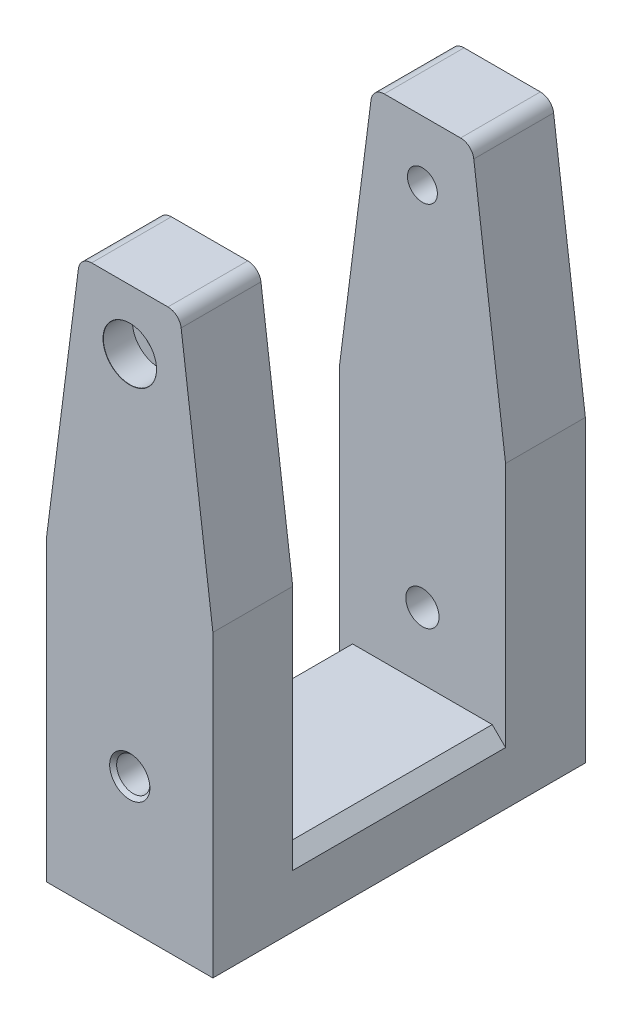
ISO-10303-21;
HEADER;
FILE_DESCRIPTION(('STEP AP214'),'2;1');
FILE_NAME('part.step','',(''),(''),'','','');
FILE_SCHEMA(('AUTOMOTIVE_DESIGN { 1 0 10303 214 1 1 1 1 }'));
ENDSEC;
DATA;
#1=APPLICATION_CONTEXT('core data for automotive mechanical design processes');
#2=APPLICATION_PROTOCOL_DEFINITION('international standard','automotive_design',2000,#1);
#3=PRODUCT_CONTEXT('',#1,'mechanical');
#4=PRODUCT('Part','Part','',(#3));
#5=PRODUCT_RELATED_PRODUCT_CATEGORY('part','',(#4));
#6=PRODUCT_DEFINITION_FORMATION('','',#4);
#7=PRODUCT_DEFINITION_CONTEXT('part definition',#1,'design');
#8=PRODUCT_DEFINITION('design','',#6,#7);
#9=PRODUCT_DEFINITION_SHAPE('','',#8);
#10=(LENGTH_UNIT() NAMED_UNIT(*) SI_UNIT(.MILLI.,.METRE.));
#11=(NAMED_UNIT(*) PLANE_ANGLE_UNIT() SI_UNIT($,.RADIAN.));
#12=(NAMED_UNIT(*) SI_UNIT($,.STERADIAN.) SOLID_ANGLE_UNIT());
#13=UNCERTAINTY_MEASURE_WITH_UNIT(LENGTH_MEASURE(1.E-05),#10,'distance_accuracy_value','');
#14=(GEOMETRIC_REPRESENTATION_CONTEXT(3) GLOBAL_UNCERTAINTY_ASSIGNED_CONTEXT((#13)) GLOBAL_UNIT_ASSIGNED_CONTEXT((#10,
#11,#12)) REPRESENTATION_CONTEXT('',''));
#15=CARTESIAN_POINT('',(0.,0.,0.));
#16=DIRECTION('',(0.,0.,1.));
#17=DIRECTION('',(1.,0.,0.));
#18=AXIS2_PLACEMENT_3D('',#15,#16,#17);
#19=CARTESIAN_POINT('',(7.5,84.,28.));
#20=DIRECTION('',(-0.991881664685851,-0.127164315985365,0.));
#21=DIRECTION('',(0.127164315985365,-0.991881664685851,0.));
#22=AXIS2_PLACEMENT_3D('',#19,#20,#21);
#23=PLANE('',#22);
#24=DIRECTION('',(-0.127164315985365,0.991881664685851,0.));
#25=VECTOR('',#24,1.);
#26=CARTESIAN_POINT('',(7.5,84.,16.));
#27=LINE('',#26,#25);
#28=CARTESIAN_POINT('',(12.5,45.,16.));
#29=VERTEX_POINT('',#28);
#30=CARTESIAN_POINT('',(7.72380402154221,82.2543286319707,16.));
#31=VERTEX_POINT('',#30);
#32=EDGE_CURVE('E301',#29,#31,#27,.T.);
#33=ORIENTED_EDGE('',*,*,#32,.T.);
#34=DIRECTION('',(0.,0.,-1.));
#35=VECTOR('',#34,1.);
#36=CARTESIAN_POINT('',(7.72380402154221,82.2543286319707,28.));
#37=LINE('',#36,#35);
#38=CARTESIAN_POINT('',(7.72380402154221,82.2543286319707,28.));
#39=VERTEX_POINT('',#38);
#40=EDGE_CURVE('E11',#31,#39,#37,.F.);
#41=ORIENTED_EDGE('',*,*,#40,.T.);
#42=DIRECTION('',(-0.127164315985365,0.99188166468585,0.));
#43=VECTOR('',#42,1.);
#44=CARTESIAN_POINT('',(7.5,84.,28.));
#45=LINE('',#44,#43);
#46=CARTESIAN_POINT('',(12.5,45.,28.));
#47=VERTEX_POINT('',#46);
#48=EDGE_CURVE('E306',#47,#39,#45,.T.);
#49=ORIENTED_EDGE('',*,*,#48,.F.);
#50=DIRECTION('',(0.,0.,-1.));
#51=VECTOR('',#50,1.);
#52=CARTESIAN_POINT('',(12.5,45.,28.));
#53=LINE('',#52,#51);
#54=EDGE_CURVE('E191',#47,#29,#53,.T.);
#55=ORIENTED_EDGE('',*,*,#54,.T.);
#56=EDGE_LOOP('',(#33,#41,#49,#55));
#57=FACE_BOUND('',#56,.T.);
#58=ADVANCED_FACE('F35',(#57),#23,.F.);
#59=CARTESIAN_POINT('',(-7.5,84.,28.));
#60=DIRECTION('',(0.,-1.,0.));
#61=DIRECTION('',(0.,0.,-1.));
#62=AXIS2_PLACEMENT_3D('',#59,#60,#61);
#63=PLANE('',#62);
#64=DIRECTION('',(1.,0.,0.));
#65=VECTOR('',#64,1.);
#66=CARTESIAN_POINT('',(-12.5,84.,16.));
#67=LINE('',#66,#65);
#68=CARTESIAN_POINT('',(-5.74004069217051,84.,16.));
#69=VERTEX_POINT('',#68);
#70=CARTESIAN_POINT('',(5.74004069217051,84.,16.));
#71=VERTEX_POINT('',#70);
#72=EDGE_CURVE('E283',#69,#71,#67,.T.);
#73=ORIENTED_EDGE('',*,*,#72,.F.);
#74=DIRECTION('',(0.,0.,-1.));
#75=VECTOR('',#74,1.);
#76=CARTESIAN_POINT('',(-5.74004069217051,84.,28.));
#77=LINE('',#76,#75);
#78=CARTESIAN_POINT('',(-5.74004069217051,84.,28.));
#79=VERTEX_POINT('',#78);
#80=EDGE_CURVE('E57',#69,#79,#77,.F.);
#81=ORIENTED_EDGE('',*,*,#80,.T.);
#82=DIRECTION('',(-1.,0.,0.));
#83=VECTOR('',#82,1.);
#84=CARTESIAN_POINT('',(-7.5,84.,28.));
#85=LINE('',#84,#83);
#86=CARTESIAN_POINT('',(5.74004069217051,84.,28.));
#87=VERTEX_POINT('',#86);
#88=EDGE_CURVE('E270',#87,#79,#85,.T.);
#89=ORIENTED_EDGE('',*,*,#88,.F.);
#90=DIRECTION('',(0.,0.,-1.));
#91=VECTOR('',#90,1.);
#92=CARTESIAN_POINT('',(5.74004069217051,84.,28.));
#93=LINE('',#92,#91);
#94=EDGE_CURVE('E258',#87,#71,#93,.T.);
#95=ORIENTED_EDGE('',*,*,#94,.T.);
#96=EDGE_LOOP('',(#73,#81,#89,#95));
#97=FACE_BOUND('',#96,.T.);
#98=ADVANCED_FACE('F285',(#97),#63,.F.);
#99=CARTESIAN_POINT('',(-12.5,45.,28.));
#100=DIRECTION('',(0.991881664685851,-0.127164315985365,0.));
#101=DIRECTION('',(0.127164315985365,0.991881664685851,0.));
#102=AXIS2_PLACEMENT_3D('',#99,#100,#101);
#103=PLANE('',#102);
#104=DIRECTION('',(-0.127164315985365,-0.99188166468585,0.));
#105=VECTOR('',#104,1.);
#106=CARTESIAN_POINT('',(-12.5,45.,28.));
#107=LINE('',#106,#105);
#108=CARTESIAN_POINT('',(-7.72380402154221,82.2543286319707,28.));
#109=VERTEX_POINT('',#108);
#110=CARTESIAN_POINT('',(-12.5,45.,28.));
#111=VERTEX_POINT('',#110);
#112=EDGE_CURVE('E268',#109,#111,#107,.T.);
#113=ORIENTED_EDGE('',*,*,#112,.F.);
#114=DIRECTION('',(0.,0.,-1.));
#115=VECTOR('',#114,1.);
#116=CARTESIAN_POINT('',(-7.72380402154221,82.2543286319707,28.));
#117=LINE('',#116,#115);
#118=CARTESIAN_POINT('',(-7.72380402154221,82.2543286319707,16.));
#119=VERTEX_POINT('',#118);
#120=EDGE_CURVE('E251',#109,#119,#117,.T.);
#121=ORIENTED_EDGE('',*,*,#120,.T.);
#122=DIRECTION('',(-0.127164315985365,-0.991881664685851,0.));
#123=VECTOR('',#122,1.);
#124=CARTESIAN_POINT('',(-12.5,45.,16.));
#125=LINE('',#124,#123);
#126=CARTESIAN_POINT('',(-12.5,45.,16.));
#127=VERTEX_POINT('',#126);
#128=EDGE_CURVE('E172',#119,#127,#125,.T.);
#129=ORIENTED_EDGE('',*,*,#128,.T.);
#130=DIRECTION('',(0.,0.,-1.));
#131=VECTOR('',#130,1.);
#132=CARTESIAN_POINT('',(-12.5,45.,28.));
#133=LINE('',#132,#131);
#134=EDGE_CURVE('E192',#111,#127,#133,.T.);
#135=ORIENTED_EDGE('',*,*,#134,.F.);
#136=EDGE_LOOP('',(#113,#121,#129,#135));
#137=FACE_BOUND('',#136,.T.);
#138=ADVANCED_FACE('F274',(#137),#103,.F.);
#139=CARTESIAN_POINT('',(12.5,45.,28.));
#140=DIRECTION('',(-1.,0.,0.));
#141=DIRECTION('',(0.,0.,1.));
#142=AXIS2_PLACEMENT_3D('',#139,#140,#141);
#143=PLANE('',#142);
#144=DIRECTION('',(0.,1.,0.));
#145=VECTOR('',#144,1.);
#146=CARTESIAN_POINT('',(12.5,84.,-16.));
#147=LINE('',#146,#145);
#148=CARTESIAN_POINT('',(12.5,7.99999999999998,-16.));
#149=VERTEX_POINT('',#148);
#150=CARTESIAN_POINT('',(12.5,45.,-16.));
#151=VERTEX_POINT('',#150);
#152=EDGE_CURVE('E176',#149,#151,#147,.T.);
#153=ORIENTED_EDGE('',*,*,#152,.F.);
#154=DIRECTION('',(0.,0.,1.));
#155=VECTOR('',#154,1.);
#156=CARTESIAN_POINT('',(12.5,7.99999999999998,28.));
#157=LINE('',#156,#155);
#158=CARTESIAN_POINT('',(12.5,7.99999999999998,16.));
#159=VERTEX_POINT('',#158);
#160=EDGE_CURVE('E224',#149,#159,#157,.T.);
#161=ORIENTED_EDGE('',*,*,#160,.T.);
#162=DIRECTION('',(0.,-1.,0.));
#163=VECTOR('',#162,1.);
#164=CARTESIAN_POINT('',(12.5,84.,16.));
#165=LINE('',#164,#163);
#166=EDGE_CURVE('E184',#29,#159,#165,.T.);
#167=ORIENTED_EDGE('',*,*,#166,.F.);
#168=ORIENTED_EDGE('',*,*,#54,.F.);
#169=DIRECTION('',(0.,1.,0.));
#170=VECTOR('',#169,1.);
#171=CARTESIAN_POINT('',(12.5,45.,28.));
#172=LINE('',#171,#170);
#173=CARTESIAN_POINT('',(12.5,0.,28.));
#174=VERTEX_POINT('',#173);
#175=EDGE_CURVE('E303',#174,#47,#172,.T.);
#176=ORIENTED_EDGE('',*,*,#175,.F.);
#177=DIRECTION('',(0.,0.,-1.));
#178=VECTOR('',#177,1.);
#179=CARTESIAN_POINT('',(12.5,0.,28.));
#180=LINE('',#179,#178);
#181=CARTESIAN_POINT('',(12.5,0.,-28.));
#182=VERTEX_POINT('',#181);
#183=EDGE_CURVE('E313',#174,#182,#180,.T.);
#184=ORIENTED_EDGE('',*,*,#183,.T.);
#185=DIRECTION('',(0.,1.,0.));
#186=VECTOR('',#185,1.);
#187=CARTESIAN_POINT('',(12.5,45.,-28.));
#188=LINE('',#187,#186);
#189=CARTESIAN_POINT('',(12.5,45.,-28.));
#190=VERTEX_POINT('',#189);
#191=EDGE_CURVE('E190',#182,#190,#188,.T.);
#192=ORIENTED_EDGE('',*,*,#191,.T.);
#193=EDGE_CURVE('E166',#151,#190,#53,.T.);
#194=ORIENTED_EDGE('',*,*,#193,.F.);
#195=EDGE_LOOP('',(#153,#161,#167,#168,#176,#184,#192,#194));
#196=FACE_BOUND('',#195,.T.);
#197=ADVANCED_FACE('F187',(#196),#143,.F.);
#198=DIRECTION('',(-0.127164315985365,0.99188166468585,0.));
#199=VECTOR('',#198,1.);
#200=CARTESIAN_POINT('',(7.5,84.,-28.));
#201=LINE('',#200,#199);
#202=CARTESIAN_POINT('',(7.72380402154221,82.2543286319707,-28.));
#203=VERTEX_POINT('',#202);
#204=EDGE_CURVE('E315',#190,#203,#201,.T.);
#205=ORIENTED_EDGE('',*,*,#204,.T.);
#206=DIRECTION('',(0.,0.,-1.));
#207=VECTOR('',#206,1.);
#208=CARTESIAN_POINT('',(7.72380402154221,82.2543286319707,28.));
#209=LINE('',#208,#207);
#210=CARTESIAN_POINT('',(7.72380402154221,82.2543286319707,-16.));
#211=VERTEX_POINT('',#210);
#212=EDGE_CURVE('E169',#203,#211,#209,.F.);
#213=ORIENTED_EDGE('',*,*,#212,.T.);
#214=DIRECTION('',(0.127164315985365,-0.991881664685851,0.));
#215=VECTOR('',#214,1.);
#216=CARTESIAN_POINT('',(7.5,84.,-16.));
#217=LINE('',#216,#215);
#218=EDGE_CURVE('E161',#211,#151,#217,.T.);
#219=ORIENTED_EDGE('',*,*,#218,.T.);
#220=ORIENTED_EDGE('',*,*,#193,.T.);
#221=EDGE_LOOP('',(#205,#213,#219,#220));
#222=FACE_BOUND('',#221,.T.);
#223=ADVANCED_FACE('F164',(#222),#23,.F.);
#224=DIRECTION('',(1.,0.,0.));
#225=VECTOR('',#224,1.);
#226=CARTESIAN_POINT('',(-12.5,84.,-16.));
#227=LINE('',#226,#225);
#228=CARTESIAN_POINT('',(-5.74004069217051,84.,-16.));
#229=VERTEX_POINT('',#228);
#230=CARTESIAN_POINT('',(5.74004069217051,84.,-16.));
#231=VERTEX_POINT('',#230);
#232=EDGE_CURVE('E287',#229,#231,#227,.T.);
#233=ORIENTED_EDGE('',*,*,#232,.T.);
#234=DIRECTION('',(0.,0.,-1.));
#235=VECTOR('',#234,1.);
#236=CARTESIAN_POINT('',(5.74004069217051,84.,28.));
#237=LINE('',#236,#235);
#238=CARTESIAN_POINT('',(5.74004069217051,84.,-28.));
#239=VERTEX_POINT('',#238);
#240=EDGE_CURVE('E236',#231,#239,#237,.T.);
#241=ORIENTED_EDGE('',*,*,#240,.T.);
#242=DIRECTION('',(-1.,0.,0.));
#243=VECTOR('',#242,1.);
#244=CARTESIAN_POINT('',(-7.5,84.,-28.));
#245=LINE('',#244,#243);
#246=CARTESIAN_POINT('',(-5.74004069217051,84.,-28.));
#247=VERTEX_POINT('',#246);
#248=EDGE_CURVE('E317',#239,#247,#245,.T.);
#249=ORIENTED_EDGE('',*,*,#248,.T.);
#250=DIRECTION('',(0.,0.,-1.));
#251=VECTOR('',#250,1.);
#252=CARTESIAN_POINT('',(-5.74004069217051,84.,28.));
#253=LINE('',#252,#251);
#254=EDGE_CURVE('E234',#247,#229,#253,.F.);
#255=ORIENTED_EDGE('',*,*,#254,.T.);
#256=EDGE_LOOP('',(#233,#241,#249,#255));
#257=FACE_BOUND('',#256,.T.);
#258=ADVANCED_FACE('F379',(#257),#63,.F.);
#259=DIRECTION('',(0.127164315985365,0.991881664685851,0.));
#260=VECTOR('',#259,1.);
#261=CARTESIAN_POINT('',(-12.5,45.,-16.));
#262=LINE('',#261,#260);
#263=CARTESIAN_POINT('',(-12.5,45.,-16.));
#264=VERTEX_POINT('',#263);
#265=CARTESIAN_POINT('',(-7.72380402154221,82.2543286319707,-16.));
#266=VERTEX_POINT('',#265);
#267=EDGE_CURVE('E173',#264,#266,#262,.T.);
#268=ORIENTED_EDGE('',*,*,#267,.T.);
#269=DIRECTION('',(0.,0.,-1.));
#270=VECTOR('',#269,1.);
#271=CARTESIAN_POINT('',(-7.72380402154221,82.2543286319707,28.));
#272=LINE('',#271,#270);
#273=CARTESIAN_POINT('',(-7.72380402154221,82.2543286319707,-28.));
#274=VERTEX_POINT('',#273);
#275=EDGE_CURVE('E248',#266,#274,#272,.T.);
#276=ORIENTED_EDGE('',*,*,#275,.T.);
#277=DIRECTION('',(-0.127164315985365,-0.99188166468585,0.));
#278=VECTOR('',#277,1.);
#279=CARTESIAN_POINT('',(-12.5,45.,-28.));
#280=LINE('',#279,#278);
#281=CARTESIAN_POINT('',(-12.5,45.,-28.));
#282=VERTEX_POINT('',#281);
#283=EDGE_CURVE('E320',#274,#282,#280,.T.);
#284=ORIENTED_EDGE('',*,*,#283,.T.);
#285=EDGE_CURVE('E197',#264,#282,#133,.T.);
#286=ORIENTED_EDGE('',*,*,#285,.F.);
#287=EDGE_LOOP('',(#268,#276,#284,#286));
#288=FACE_BOUND('',#287,.T.);
#289=ADVANCED_FACE('F386',(#288),#103,.F.);
#290=CARTESIAN_POINT('',(-12.5,0.,28.));
#291=DIRECTION('',(1.,0.,0.));
#292=DIRECTION('',(0.,0.,-1.));
#293=AXIS2_PLACEMENT_3D('',#290,#291,#292);
#294=PLANE('',#293);
#295=DIRECTION('',(0.,0.,-1.));
#296=VECTOR('',#295,1.);
#297=CARTESIAN_POINT('',(-12.5,7.99999999999998,28.));
#298=LINE('',#297,#296);
#299=CARTESIAN_POINT('',(-12.5,7.99999999999998,16.));
#300=VERTEX_POINT('',#299);
#301=CARTESIAN_POINT('',(-12.5,7.99999999999998,-16.));
#302=VERTEX_POINT('',#301);
#303=EDGE_CURVE('E202',#300,#302,#298,.T.);
#304=ORIENTED_EDGE('',*,*,#303,.T.);
#305=DIRECTION('',(0.,1.,0.));
#306=VECTOR('',#305,1.);
#307=CARTESIAN_POINT('',(-12.5,84.,-16.));
#308=LINE('',#307,#306);
#309=EDGE_CURVE('E183',#302,#264,#308,.T.);
#310=ORIENTED_EDGE('',*,*,#309,.T.);
#311=ORIENTED_EDGE('',*,*,#285,.T.);
#312=DIRECTION('',(0.,-1.,0.));
#313=VECTOR('',#312,1.);
#314=CARTESIAN_POINT('',(-12.5,0.,-28.));
#315=LINE('',#314,#313);
#316=CARTESIAN_POINT('',(-12.5,0.,-28.));
#317=VERTEX_POINT('',#316);
#318=EDGE_CURVE('E322',#282,#317,#315,.T.);
#319=ORIENTED_EDGE('',*,*,#318,.T.);
#320=DIRECTION('',(0.,0.,-1.));
#321=VECTOR('',#320,1.);
#322=CARTESIAN_POINT('',(-12.5,0.,28.));
#323=LINE('',#322,#321);
#324=CARTESIAN_POINT('',(-12.5,0.,28.));
#325=VERTEX_POINT('',#324);
#326=EDGE_CURVE('E325',#325,#317,#323,.T.);
#327=ORIENTED_EDGE('',*,*,#326,.F.);
#328=DIRECTION('',(0.,-1.,0.));
#329=VECTOR('',#328,1.);
#330=CARTESIAN_POINT('',(-12.5,0.,28.));
#331=LINE('',#330,#329);
#332=EDGE_CURVE('E277',#111,#325,#331,.T.);
#333=ORIENTED_EDGE('',*,*,#332,.F.);
#334=ORIENTED_EDGE('',*,*,#134,.T.);
#335=DIRECTION('',(0.,-1.,0.));
#336=VECTOR('',#335,1.);
#337=CARTESIAN_POINT('',(-12.5,0.,16.));
#338=LINE('',#337,#336);
#339=EDGE_CURVE('E195',#127,#300,#338,.T.);
#340=ORIENTED_EDGE('',*,*,#339,.T.);
#341=EDGE_LOOP('',(#304,#310,#311,#319,#327,#333,#334,#340));
#342=FACE_BOUND('',#341,.T.);
#343=ADVANCED_FACE('F336',(#342),#294,.F.);
#344=CARTESIAN_POINT('',(12.5,0.,28.));
#345=DIRECTION('',(0.,1.,0.));
#346=DIRECTION('',(0.,0.,1.));
#347=AXIS2_PLACEMENT_3D('',#344,#345,#346);
#348=PLANE('',#347);
#349=DIRECTION('',(1.,0.,0.));
#350=VECTOR('',#349,1.);
#351=CARTESIAN_POINT('',(12.5,0.,-28.));
#352=LINE('',#351,#350);
#353=EDGE_CURVE('E307',#317,#182,#352,.T.);
#354=ORIENTED_EDGE('',*,*,#353,.T.);
#355=ORIENTED_EDGE('',*,*,#183,.F.);
#356=DIRECTION('',(1.,0.,0.));
#357=VECTOR('',#356,1.);
#358=CARTESIAN_POINT('',(12.5,0.,28.));
#359=LINE('',#358,#357);
#360=EDGE_CURVE('E311',#325,#174,#359,.T.);
#361=ORIENTED_EDGE('',*,*,#360,.F.);
#362=ORIENTED_EDGE('',*,*,#326,.T.);
#363=EDGE_LOOP('',(#354,#355,#361,#362));
#364=FACE_BOUND('',#363,.T.);
#365=ADVANCED_FACE('F343',(#364),#348,.F.);
#366=CARTESIAN_POINT('',(0.,0.,28.));
#367=DIRECTION('',(0.,0.,-1.));
#368=DIRECTION('',(-1.,0.,0.));
#369=AXIS2_PLACEMENT_3D('',#366,#367,#368);
#370=PLANE('',#369);
#371=CARTESIAN_POINT('',(0.,20.,28.));
#372=DIRECTION('',(0.,0.,1.));
#373=DIRECTION('',(1.,0.,0.));
#374=AXIS2_PLACEMENT_3D('',#371,#372,#373);
#375=CIRCLE('',#374,3.025);
#376=CARTESIAN_POINT('',(3.025,20.,28.));
#377=VERTEX_POINT('',#376);
#378=EDGE_CURVE('E485',#377,#377,#375,.T.);
#379=ORIENTED_EDGE('',*,*,#378,.F.);
#380=EDGE_LOOP('',(#379));
#381=FACE_BOUND('',#380,.T.);
#382=CARTESIAN_POINT('',(0.,75.,28.));
#383=DIRECTION('',(0.,0.,1.));
#384=DIRECTION('',(1.,0.,0.));
#385=AXIS2_PLACEMENT_3D('',#382,#383,#384);
#386=CIRCLE('',#385,4.025);
#387=CARTESIAN_POINT('',(4.025,75.,28.));
#388=VERTEX_POINT('',#387);
#389=EDGE_CURVE('E210',#388,#388,#386,.T.);
#390=ORIENTED_EDGE('',*,*,#389,.F.);
#391=EDGE_LOOP('',(#390));
#392=FACE_BOUND('',#391,.T.);
#393=ORIENTED_EDGE('',*,*,#88,.T.);
#394=CARTESIAN_POINT('',(-5.74004069217051,82.,28.));
#395=DIRECTION('',(0.,0.,-1.));
#396=DIRECTION('',(-1.,0.,0.));
#397=AXIS2_PLACEMENT_3D('',#394,#395,#396);
#398=CIRCLE('',#397,2.);
#399=EDGE_CURVE('E44',#79,#109,#398,.F.);
#400=ORIENTED_EDGE('',*,*,#399,.T.);
#401=ORIENTED_EDGE('',*,*,#112,.T.);
#402=ORIENTED_EDGE('',*,*,#332,.T.);
#403=ORIENTED_EDGE('',*,*,#360,.T.);
#404=ORIENTED_EDGE('',*,*,#175,.T.);
#405=ORIENTED_EDGE('',*,*,#48,.T.);
#406=CARTESIAN_POINT('',(5.74004069217051,82.,28.));
#407=DIRECTION('',(0.,0.,-1.));
#408=DIRECTION('',(-1.,0.,0.));
#409=AXIS2_PLACEMENT_3D('',#406,#407,#408);
#410=CIRCLE('',#409,2.);
#411=EDGE_CURVE('E262',#39,#87,#410,.F.);
#412=ORIENTED_EDGE('',*,*,#411,.T.);
#413=EDGE_LOOP('',(#393,#400,#401,#402,#403,#404,#405,#412));
#414=FACE_BOUND('',#413,.T.);
#415=ADVANCED_FACE('F267',(#381,#392,#414),#370,.F.);
#416=CARTESIAN_POINT('',(0.,0.,-28.));
#417=DIRECTION('',(0.,0.,-1.));
#418=DIRECTION('',(-1.,0.,0.));
#419=AXIS2_PLACEMENT_3D('',#416,#417,#418);
#420=PLANE('',#419);
#421=CARTESIAN_POINT('',(0.,20.,-28.));
#422=DIRECTION('',(0.,0.,-1.));
#423=DIRECTION('',(-1.,0.,0.));
#424=AXIS2_PLACEMENT_3D('',#421,#422,#423);
#425=CIRCLE('',#424,3.025);
#426=CARTESIAN_POINT('',(-3.025,20.,-28.));
#427=VERTEX_POINT('',#426);
#428=EDGE_CURVE('E481',#427,#427,#425,.T.);
#429=ORIENTED_EDGE('',*,*,#428,.F.);
#430=EDGE_LOOP('',(#429));
#431=FACE_BOUND('',#430,.T.);
#432=CARTESIAN_POINT('',(0.,75.,-28.));
#433=DIRECTION('',(0.,0.,-1.));
#434=DIRECTION('',(-1.,0.,0.));
#435=AXIS2_PLACEMENT_3D('',#432,#433,#434);
#436=CIRCLE('',#435,4.025);
#437=CARTESIAN_POINT('',(-4.025,75.,-28.));
#438=VERTEX_POINT('',#437);
#439=EDGE_CURVE('E215',#438,#438,#436,.T.);
#440=ORIENTED_EDGE('',*,*,#439,.F.);
#441=EDGE_LOOP('',(#440));
#442=FACE_BOUND('',#441,.T.);
#443=ORIENTED_EDGE('',*,*,#248,.F.);
#444=CARTESIAN_POINT('',(5.74004069217051,82.,-28.));
#445=DIRECTION('',(0.,0.,-1.));
#446=DIRECTION('',(-1.,0.,0.));
#447=AXIS2_PLACEMENT_3D('',#444,#445,#446);
#448=CIRCLE('',#447,2.);
#449=EDGE_CURVE('E241',#239,#203,#448,.T.);
#450=ORIENTED_EDGE('',*,*,#449,.T.);
#451=ORIENTED_EDGE('',*,*,#204,.F.);
#452=ORIENTED_EDGE('',*,*,#191,.F.);
#453=ORIENTED_EDGE('',*,*,#353,.F.);
#454=ORIENTED_EDGE('',*,*,#318,.F.);
#455=ORIENTED_EDGE('',*,*,#283,.F.);
#456=CARTESIAN_POINT('',(-5.74004069217051,82.,-28.));
#457=DIRECTION('',(0.,0.,-1.));
#458=DIRECTION('',(-1.,0.,0.));
#459=AXIS2_PLACEMENT_3D('',#456,#457,#458);
#460=CIRCLE('',#459,2.);
#461=EDGE_CURVE('E239',#274,#247,#460,.T.);
#462=ORIENTED_EDGE('',*,*,#461,.T.);
#463=EDGE_LOOP('',(#443,#450,#451,#452,#453,#454,#455,#462));
#464=FACE_BOUND('',#463,.T.);
#465=ADVANCED_FACE('F341',(#431,#442,#464),#420,.T.);
#466=CARTESIAN_POINT('',(-12.5,84.,16.));
#467=DIRECTION('',(0.,0.,1.));
#468=DIRECTION('',(0.,-1.,0.));
#469=AXIS2_PLACEMENT_3D('',#466,#467,#468);
#470=PLANE('',#469);
#471=CARTESIAN_POINT('',(0.,20.,16.));
#472=DIRECTION('',(0.,0.,1.));
#473=DIRECTION('',(0.,-1.,0.));
#474=AXIS2_PLACEMENT_3D('',#471,#472,#473);
#475=CIRCLE('',#474,2.5);
#476=CARTESIAN_POINT('',(0.,17.5,16.));
#477=VERTEX_POINT('',#476);
#478=EDGE_CURVE('E212',#477,#477,#475,.T.);
#479=ORIENTED_EDGE('',*,*,#478,.T.);
#480=EDGE_LOOP('',(#479));
#481=FACE_BOUND('',#480,.T.);
#482=CARTESIAN_POINT('',(0.,75.,16.));
#483=DIRECTION('',(0.,0.,1.));
#484=DIRECTION('',(0.,-1.,0.));
#485=AXIS2_PLACEMENT_3D('',#482,#483,#484);
#486=CIRCLE('',#485,2.25);
#487=CARTESIAN_POINT('',(0.,72.75,16.));
#488=VERTEX_POINT('',#487);
#489=EDGE_CURVE('E203',#488,#488,#486,.T.);
#490=ORIENTED_EDGE('',*,*,#489,.T.);
#491=EDGE_LOOP('',(#490));
#492=FACE_BOUND('',#491,.T.);
#493=ORIENTED_EDGE('',*,*,#128,.F.);
#494=CARTESIAN_POINT('',(-5.74004069217051,82.,16.));
#495=DIRECTION('',(0.,0.,1.));
#496=DIRECTION('',(0.,-1.,0.));
#497=AXIS2_PLACEMENT_3D('',#494,#495,#496);
#498=CIRCLE('',#497,2.);
#499=EDGE_CURVE('E256',#119,#69,#498,.F.);
#500=ORIENTED_EDGE('',*,*,#499,.T.);
#501=ORIENTED_EDGE('',*,*,#72,.T.);
#502=CARTESIAN_POINT('',(5.74004069217051,82.,16.));
#503=DIRECTION('',(0.,0.,1.));
#504=DIRECTION('',(0.,-1.,0.));
#505=AXIS2_PLACEMENT_3D('',#502,#503,#504);
#506=CIRCLE('',#505,2.);
#507=EDGE_CURVE('E254',#71,#31,#506,.F.);
#508=ORIENTED_EDGE('',*,*,#507,.T.);
#509=ORIENTED_EDGE('',*,*,#32,.F.);
#510=ORIENTED_EDGE('',*,*,#166,.T.);
#511=DIRECTION('',(0.707106781186546,-0.707106781186549,0.));
#512=VECTOR('',#511,1.);
#513=CARTESIAN_POINT('',(-37.9999999999999,58.5000000000002,16.));
#514=LINE('',#513,#512);
#515=CARTESIAN_POINT('',(10.5,9.99999999999999,16.));
#516=VERTEX_POINT('',#515);
#517=EDGE_CURVE('E232',#159,#516,#514,.F.);
#518=ORIENTED_EDGE('',*,*,#517,.T.);
#519=DIRECTION('',(1.,0.,0.));
#520=VECTOR('',#519,1.);
#521=CARTESIAN_POINT('',(-12.5,9.99999999999999,16.));
#522=LINE('',#521,#520);
#523=CARTESIAN_POINT('',(-10.5,9.99999999999999,16.));
#524=VERTEX_POINT('',#523);
#525=EDGE_CURVE('E297',#524,#516,#522,.T.);
#526=ORIENTED_EDGE('',*,*,#525,.F.);
#527=DIRECTION('',(0.70710678118655,0.707106781186545,0.));
#528=VECTOR('',#527,1.);
#529=CARTESIAN_POINT('',(25.5,45.9999999999997,16.));
#530=LINE('',#529,#528);
#531=EDGE_CURVE('E228',#524,#300,#530,.F.);
#532=ORIENTED_EDGE('',*,*,#531,.T.);
#533=ORIENTED_EDGE('',*,*,#339,.F.);
#534=EDGE_LOOP('',(#493,#500,#501,#508,#509,#510,#518,#526,#532,#533));
#535=FACE_BOUND('',#534,.T.);
#536=ADVANCED_FACE('F282',(#481,#492,#535),#470,.F.);
#537=CARTESIAN_POINT('',(-12.5,84.,-16.));
#538=DIRECTION('',(0.,0.,-1.));
#539=DIRECTION('',(0.,1.,0.));
#540=AXIS2_PLACEMENT_3D('',#537,#538,#539);
#541=PLANE('',#540);
#542=CARTESIAN_POINT('',(0.,20.,-16.));
#543=DIRECTION('',(0.,0.,-1.));
#544=DIRECTION('',(0.,1.,0.));
#545=AXIS2_PLACEMENT_3D('',#542,#543,#544);
#546=CIRCLE('',#545,2.5);
#547=CARTESIAN_POINT('',(0.,22.5,-16.));
#548=VERTEX_POINT('',#547);
#549=EDGE_CURVE('E39',#548,#548,#546,.T.);
#550=ORIENTED_EDGE('',*,*,#549,.T.);
#551=EDGE_LOOP('',(#550));
#552=FACE_BOUND('',#551,.T.);
#553=CARTESIAN_POINT('',(0.,75.,-16.));
#554=DIRECTION('',(0.,0.,-1.));
#555=DIRECTION('',(0.,1.,0.));
#556=AXIS2_PLACEMENT_3D('',#553,#554,#555);
#557=CIRCLE('',#556,2.25);
#558=CARTESIAN_POINT('',(0.,77.25,-16.));
#559=VERTEX_POINT('',#558);
#560=EDGE_CURVE('E207',#559,#559,#557,.T.);
#561=ORIENTED_EDGE('',*,*,#560,.T.);
#562=EDGE_LOOP('',(#561));
#563=FACE_BOUND('',#562,.T.);
#564=ORIENTED_EDGE('',*,*,#218,.F.);
#565=CARTESIAN_POINT('',(5.74004069217051,82.,-16.));
#566=DIRECTION('',(0.,0.,-1.));
#567=DIRECTION('',(0.,1.,0.));
#568=AXIS2_PLACEMENT_3D('',#565,#566,#567);
#569=CIRCLE('',#568,2.);
#570=EDGE_CURVE('E246',#211,#231,#569,.F.);
#571=ORIENTED_EDGE('',*,*,#570,.T.);
#572=ORIENTED_EDGE('',*,*,#232,.F.);
#573=CARTESIAN_POINT('',(-5.74004069217051,82.,-16.));
#574=DIRECTION('',(0.,0.,-1.));
#575=DIRECTION('',(0.,1.,0.));
#576=AXIS2_PLACEMENT_3D('',#573,#574,#575);
#577=CIRCLE('',#576,2.);
#578=EDGE_CURVE('E244',#229,#266,#577,.F.);
#579=ORIENTED_EDGE('',*,*,#578,.T.);
#580=ORIENTED_EDGE('',*,*,#267,.F.);
#581=ORIENTED_EDGE('',*,*,#309,.F.);
#582=DIRECTION('',(-0.70710678118655,-0.707106781186545,0.));
#583=VECTOR('',#582,1.);
#584=CARTESIAN_POINT('',(25.5,45.9999999999997,-16.));
#585=LINE('',#584,#583);
#586=CARTESIAN_POINT('',(-10.5,10.,-16.));
#587=VERTEX_POINT('',#586);
#588=EDGE_CURVE('E226',#302,#587,#585,.F.);
#589=ORIENTED_EDGE('',*,*,#588,.T.);
#590=DIRECTION('',(1.,0.,0.));
#591=VECTOR('',#590,1.);
#592=CARTESIAN_POINT('',(-12.5,10.,-16.));
#593=LINE('',#592,#591);
#594=CARTESIAN_POINT('',(10.5,10.,-16.));
#595=VERTEX_POINT('',#594);
#596=EDGE_CURVE('E292',#587,#595,#593,.T.);
#597=ORIENTED_EDGE('',*,*,#596,.T.);
#598=DIRECTION('',(-0.707106781186546,0.707106781186549,0.));
#599=VECTOR('',#598,1.);
#600=CARTESIAN_POINT('',(-37.9999999999999,58.5000000000002,-16.));
#601=LINE('',#600,#599);
#602=EDGE_CURVE('E179',#595,#149,#601,.F.);
#603=ORIENTED_EDGE('',*,*,#602,.T.);
#604=ORIENTED_EDGE('',*,*,#152,.T.);
#605=EDGE_LOOP('',(#564,#571,#572,#579,#580,#581,#589,#597,#603,#604));
#606=FACE_BOUND('',#605,.T.);
#607=ADVANCED_FACE('F177',(#552,#563,#606),#541,.F.);
#608=CARTESIAN_POINT('',(-12.5,9.99999999999999,16.));
#609=DIRECTION('',(0.,-1.,0.));
#610=DIRECTION('',(0.,0.,-1.));
#611=AXIS2_PLACEMENT_3D('',#608,#609,#610);
#612=PLANE('',#611);
#613=ORIENTED_EDGE('',*,*,#596,.F.);
#614=DIRECTION('',(0.,0.,1.));
#615=VECTOR('',#614,1.);
#616=CARTESIAN_POINT('',(-10.5,9.99999999999999,16.));
#617=LINE('',#616,#615);
#618=EDGE_CURVE('E222',#587,#524,#617,.T.);
#619=ORIENTED_EDGE('',*,*,#618,.T.);
#620=ORIENTED_EDGE('',*,*,#525,.T.);
#621=DIRECTION('',(0.,0.,-1.));
#622=VECTOR('',#621,1.);
#623=CARTESIAN_POINT('',(10.5,9.99999999999999,16.));
#624=LINE('',#623,#622);
#625=EDGE_CURVE('E219',#516,#595,#624,.T.);
#626=ORIENTED_EDGE('',*,*,#625,.T.);
#627=EDGE_LOOP('',(#613,#619,#620,#626));
#628=FACE_BOUND('',#627,.T.);
#629=ADVANCED_FACE('F357',(#628),#612,.F.);
#630=CARTESIAN_POINT('',(0.,75.,28.));
#631=DIRECTION('',(0.,0.,1.));
#632=DIRECTION('',(1.,0.,0.));
#633=AXIS2_PLACEMENT_3D('',#630,#631,#632);
#634=CYLINDRICAL_SURFACE('',#633,2.25);
#635=CARTESIAN_POINT('',(0.,75.,23.6));
#636=DIRECTION('',(0.,0.,1.));
#637=DIRECTION('',(1.,0.,0.));
#638=AXIS2_PLACEMENT_3D('',#635,#636,#637);
#639=CIRCLE('',#638,2.25);
#640=CARTESIAN_POINT('',(2.25,75.,23.6));
#641=VERTEX_POINT('',#640);
#642=EDGE_CURVE('E206',#641,#641,#639,.T.);
#643=ORIENTED_EDGE('',*,*,#642,.T.);
#644=EDGE_LOOP('',(#643));
#645=FACE_BOUND('',#644,.T.);
#646=ORIENTED_EDGE('',*,*,#489,.F.);
#647=EDGE_LOOP('',(#646));
#648=FACE_BOUND('',#647,.T.);
#649=ADVANCED_FACE('F429',(#645,#648),#634,.F.);
#650=CARTESIAN_POINT('',(2.25,75.,23.6));
#651=DIRECTION('',(0.,0.,-1.));
#652=DIRECTION('',(-1.,0.,0.));
#653=AXIS2_PLACEMENT_3D('',#650,#651,#652);
#654=PLANE('',#653);
#655=ORIENTED_EDGE('',*,*,#642,.F.);
#656=EDGE_LOOP('',(#655));
#657=FACE_BOUND('',#656,.T.);
#658=CARTESIAN_POINT('',(0.,75.,23.6));
#659=DIRECTION('',(0.,0.,1.));
#660=DIRECTION('',(1.,0.,0.));
#661=AXIS2_PLACEMENT_3D('',#658,#659,#660);
#662=CIRCLE('',#661,4.);
#663=CARTESIAN_POINT('',(4.,75.,23.6));
#664=VERTEX_POINT('',#663);
#665=EDGE_CURVE('E505',#664,#664,#662,.T.);
#666=ORIENTED_EDGE('',*,*,#665,.T.);
#667=EDGE_LOOP('',(#666));
#668=FACE_BOUND('',#667,.T.);
#669=ADVANCED_FACE('F435',(#657,#668),#654,.F.);
#670=CARTESIAN_POINT('',(0.,75.,28.));
#671=DIRECTION('',(0.,0.,1.));
#672=DIRECTION('',(1.,0.,0.));
#673=AXIS2_PLACEMENT_3D('',#670,#671,#672);
#674=CYLINDRICAL_SURFACE('',#673,4.);
#675=ORIENTED_EDGE('',*,*,#665,.F.);
#676=EDGE_LOOP('',(#675));
#677=FACE_BOUND('',#676,.T.);
#678=CARTESIAN_POINT('',(0.,75.,27.975));
#679=DIRECTION('',(0.,0.,1.));
#680=DIRECTION('',(1.,0.,0.));
#681=AXIS2_PLACEMENT_3D('',#678,#679,#680);
#682=CIRCLE('',#681,4.);
#683=CARTESIAN_POINT('',(4.,75.,27.975));
#684=VERTEX_POINT('',#683);
#685=EDGE_CURVE('E502',#684,#684,#682,.T.);
#686=ORIENTED_EDGE('',*,*,#685,.T.);
#687=EDGE_LOOP('',(#686));
#688=FACE_BOUND('',#687,.T.);
#689=ADVANCED_FACE('F439',(#677,#688),#674,.F.);
#690=CARTESIAN_POINT('',(0.,75.,28.));
#691=DIRECTION('',(0.,0.,1.));
#692=DIRECTION('',(1.,0.,0.));
#693=AXIS2_PLACEMENT_3D('',#690,#691,#692);
#694=CONICAL_SURFACE('',#693,4.025,0.785398163397431);
#695=ORIENTED_EDGE('',*,*,#685,.F.);
#696=EDGE_LOOP('',(#695));
#697=FACE_BOUND('',#696,.T.);
#698=ORIENTED_EDGE('',*,*,#389,.T.);
#699=EDGE_LOOP('',(#698));
#700=FACE_BOUND('',#699,.T.);
#701=ADVANCED_FACE('F443',(#697,#700),#694,.F.);
#702=CARTESIAN_POINT('',(0.,75.,-28.));
#703=DIRECTION('',(0.,0.,-1.));
#704=DIRECTION('',(-1.,0.,0.));
#705=AXIS2_PLACEMENT_3D('',#702,#703,#704);
#706=CYLINDRICAL_SURFACE('',#705,2.25);
#707=CARTESIAN_POINT('',(0.,75.,-23.6));
#708=DIRECTION('',(0.,0.,-1.));
#709=DIRECTION('',(-1.,0.,0.));
#710=AXIS2_PLACEMENT_3D('',#707,#708,#709);
#711=CIRCLE('',#710,2.25);
#712=CARTESIAN_POINT('',(-2.25,75.,-23.6));
#713=VERTEX_POINT('',#712);
#714=EDGE_CURVE('E211',#713,#713,#711,.T.);
#715=ORIENTED_EDGE('',*,*,#714,.T.);
#716=EDGE_LOOP('',(#715));
#717=FACE_BOUND('',#716,.T.);
#718=ORIENTED_EDGE('',*,*,#560,.F.);
#719=EDGE_LOOP('',(#718));
#720=FACE_BOUND('',#719,.T.);
#721=ADVANCED_FACE('F447',(#717,#720),#706,.F.);
#722=CARTESIAN_POINT('',(2.25,75.,-23.6));
#723=DIRECTION('',(0.,0.,1.));
#724=DIRECTION('',(1.,0.,0.));
#725=AXIS2_PLACEMENT_3D('',#722,#723,#724);
#726=PLANE('',#725);
#727=ORIENTED_EDGE('',*,*,#714,.F.);
#728=EDGE_LOOP('',(#727));
#729=FACE_BOUND('',#728,.T.);
#730=CARTESIAN_POINT('',(0.,75.,-23.6));
#731=DIRECTION('',(0.,0.,-1.));
#732=DIRECTION('',(-1.,0.,0.));
#733=AXIS2_PLACEMENT_3D('',#730,#731,#732);
#734=CIRCLE('',#733,4.);
#735=CARTESIAN_POINT('',(-4.,75.,-23.6));
#736=VERTEX_POINT('',#735);
#737=EDGE_CURVE('E495',#736,#736,#734,.T.);
#738=ORIENTED_EDGE('',*,*,#737,.T.);
#739=EDGE_LOOP('',(#738));
#740=FACE_BOUND('',#739,.T.);
#741=ADVANCED_FACE('F451',(#729,#740),#726,.F.);
#742=CARTESIAN_POINT('',(0.,75.,-28.));
#743=DIRECTION('',(0.,0.,-1.));
#744=DIRECTION('',(-1.,0.,0.));
#745=AXIS2_PLACEMENT_3D('',#742,#743,#744);
#746=CYLINDRICAL_SURFACE('',#745,4.);
#747=ORIENTED_EDGE('',*,*,#737,.F.);
#748=EDGE_LOOP('',(#747));
#749=FACE_BOUND('',#748,.T.);
#750=CARTESIAN_POINT('',(0.,75.,-27.975));
#751=DIRECTION('',(0.,0.,-1.));
#752=DIRECTION('',(-1.,0.,0.));
#753=AXIS2_PLACEMENT_3D('',#750,#751,#752);
#754=CIRCLE('',#753,4.);
#755=CARTESIAN_POINT('',(-4.,75.,-27.975));
#756=VERTEX_POINT('',#755);
#757=EDGE_CURVE('E492',#756,#756,#754,.T.);
#758=ORIENTED_EDGE('',*,*,#757,.T.);
#759=EDGE_LOOP('',(#758));
#760=FACE_BOUND('',#759,.T.);
#761=ADVANCED_FACE('F455',(#749,#760),#746,.F.);
#762=CARTESIAN_POINT('',(0.,75.,-28.));
#763=DIRECTION('',(0.,0.,-1.));
#764=DIRECTION('',(-1.,0.,0.));
#765=AXIS2_PLACEMENT_3D('',#762,#763,#764);
#766=CONICAL_SURFACE('',#765,4.025,0.785398163397431);
#767=ORIENTED_EDGE('',*,*,#757,.F.);
#768=EDGE_LOOP('',(#767));
#769=FACE_BOUND('',#768,.T.);
#770=ORIENTED_EDGE('',*,*,#439,.T.);
#771=EDGE_LOOP('',(#770));
#772=FACE_BOUND('',#771,.T.);
#773=ADVANCED_FACE('F459',(#769,#772),#766,.F.);
#774=CARTESIAN_POINT('',(0.,20.,28.));
#775=DIRECTION('',(0.,0.,1.));
#776=DIRECTION('',(1.,0.,0.));
#777=AXIS2_PLACEMENT_3D('',#774,#775,#776);
#778=CYLINDRICAL_SURFACE('',#777,2.5);
#779=CARTESIAN_POINT('',(0.,20.,27.475));
#780=DIRECTION('',(0.,0.,1.));
#781=DIRECTION('',(1.,0.,0.));
#782=AXIS2_PLACEMENT_3D('',#779,#780,#781);
#783=CIRCLE('',#782,2.5);
#784=CARTESIAN_POINT('',(2.5,20.,27.475));
#785=VERTEX_POINT('',#784);
#786=EDGE_CURVE('E216',#785,#785,#783,.T.);
#787=ORIENTED_EDGE('',*,*,#786,.T.);
#788=EDGE_LOOP('',(#787));
#789=FACE_BOUND('',#788,.T.);
#790=ORIENTED_EDGE('',*,*,#478,.F.);
#791=EDGE_LOOP('',(#790));
#792=FACE_BOUND('',#791,.T.);
#793=ADVANCED_FACE('F463',(#789,#792),#778,.F.);
#794=CARTESIAN_POINT('',(0.,20.,28.));
#795=DIRECTION('',(0.,0.,1.));
#796=DIRECTION('',(1.,0.,0.));
#797=AXIS2_PLACEMENT_3D('',#794,#795,#796);
#798=CONICAL_SURFACE('',#797,3.025,0.785398163397449);
#799=ORIENTED_EDGE('',*,*,#786,.F.);
#800=EDGE_LOOP('',(#799));
#801=FACE_BOUND('',#800,.T.);
#802=ORIENTED_EDGE('',*,*,#378,.T.);
#803=EDGE_LOOP('',(#802));
#804=FACE_BOUND('',#803,.T.);
#805=ADVANCED_FACE('F395',(#801,#804),#798,.F.);
#806=CARTESIAN_POINT('',(-12.5,7.99999999999998,28.));
#807=DIRECTION('',(0.707106781186545,-0.70710678118655,0.));
#808=DIRECTION('',(0.,0.,-1.));
#809=AXIS2_PLACEMENT_3D('',#806,#807,#808);
#810=PLANE('',#809);
#811=ORIENTED_EDGE('',*,*,#531,.F.);
#812=ORIENTED_EDGE('',*,*,#618,.F.);
#813=ORIENTED_EDGE('',*,*,#588,.F.);
#814=ORIENTED_EDGE('',*,*,#303,.F.);
#815=EDGE_LOOP('',(#811,#812,#813,#814));
#816=FACE_BOUND('',#815,.T.);
#817=ADVANCED_FACE('F354',(#816),#810,.F.);
#818=CARTESIAN_POINT('',(10.5,9.99999999999999,16.));
#819=DIRECTION('',(-0.707106781186549,-0.707106781186546,0.));
#820=DIRECTION('',(0.,0.,-1.));
#821=AXIS2_PLACEMENT_3D('',#818,#819,#820);
#822=PLANE('',#821);
#823=ORIENTED_EDGE('',*,*,#517,.F.);
#824=ORIENTED_EDGE('',*,*,#160,.F.);
#825=ORIENTED_EDGE('',*,*,#602,.F.);
#826=ORIENTED_EDGE('',*,*,#625,.F.);
#827=EDGE_LOOP('',(#823,#824,#825,#826));
#828=FACE_BOUND('',#827,.T.);
#829=ADVANCED_FACE('F361',(#828),#822,.F.);
#830=CARTESIAN_POINT('',(5.74004069217051,82.,28.));
#831=DIRECTION('',(0.,0.,-1.));
#832=DIRECTION('',(-1.,0.,0.));
#833=AXIS2_PLACEMENT_3D('',#830,#831,#832);
#834=CYLINDRICAL_SURFACE('',#833,2.);
#835=ORIENTED_EDGE('',*,*,#570,.F.);
#836=ORIENTED_EDGE('',*,*,#212,.F.);
#837=ORIENTED_EDGE('',*,*,#449,.F.);
#838=ORIENTED_EDGE('',*,*,#240,.F.);
#839=EDGE_LOOP('',(#835,#836,#837,#838));
#840=FACE_BOUND('',#839,.T.);
#841=ADVANCED_FACE('F398',(#840),#834,.T.);
#842=CARTESIAN_POINT('',(-5.74004069217051,82.,28.));
#843=DIRECTION('',(0.,0.,-1.));
#844=DIRECTION('',(-1.,0.,0.));
#845=AXIS2_PLACEMENT_3D('',#842,#843,#844);
#846=CYLINDRICAL_SURFACE('',#845,2.);
#847=ORIENTED_EDGE('',*,*,#578,.F.);
#848=ORIENTED_EDGE('',*,*,#254,.F.);
#849=ORIENTED_EDGE('',*,*,#461,.F.);
#850=ORIENTED_EDGE('',*,*,#275,.F.);
#851=EDGE_LOOP('',(#847,#848,#849,#850));
#852=FACE_BOUND('',#851,.T.);
#853=ADVANCED_FACE('F372',(#852),#846,.T.);
#854=CARTESIAN_POINT('',(-5.74004069217051,82.,28.));
#855=DIRECTION('',(0.,0.,-1.));
#856=DIRECTION('',(-1.,0.,0.));
#857=AXIS2_PLACEMENT_3D('',#854,#855,#856);
#858=CYLINDRICAL_SURFACE('',#857,2.);
#859=ORIENTED_EDGE('',*,*,#399,.F.);
#860=ORIENTED_EDGE('',*,*,#80,.F.);
#861=ORIENTED_EDGE('',*,*,#499,.F.);
#862=ORIENTED_EDGE('',*,*,#120,.F.);
#863=EDGE_LOOP('',(#859,#860,#861,#862));
#864=FACE_BOUND('',#863,.T.);
#865=ADVANCED_FACE('F279',(#864),#858,.T.);
#866=CARTESIAN_POINT('',(5.74004069217051,82.,28.));
#867=DIRECTION('',(0.,0.,-1.));
#868=DIRECTION('',(-1.,0.,0.));
#869=AXIS2_PLACEMENT_3D('',#866,#867,#868);
#870=CYLINDRICAL_SURFACE('',#869,2.);
#871=ORIENTED_EDGE('',*,*,#411,.F.);
#872=ORIENTED_EDGE('',*,*,#40,.F.);
#873=ORIENTED_EDGE('',*,*,#507,.F.);
#874=ORIENTED_EDGE('',*,*,#94,.F.);
#875=EDGE_LOOP('',(#871,#872,#873,#874));
#876=FACE_BOUND('',#875,.T.);
#877=ADVANCED_FACE('F37',(#876),#870,.T.);
#878=CARTESIAN_POINT('',(0.,20.,-28.));
#879=DIRECTION('',(0.,0.,-1.));
#880=DIRECTION('',(-1.,0.,0.));
#881=AXIS2_PLACEMENT_3D('',#878,#879,#880);
#882=CYLINDRICAL_SURFACE('',#881,2.5);
#883=CARTESIAN_POINT('',(0.,20.,-27.475));
#884=DIRECTION('',(0.,0.,-1.));
#885=DIRECTION('',(-1.,0.,0.));
#886=AXIS2_PLACEMENT_3D('',#883,#884,#885);
#887=CIRCLE('',#886,2.5);
#888=CARTESIAN_POINT('',(-2.5,20.,-27.475));
#889=VERTEX_POINT('',#888);
#890=EDGE_CURVE('E478',#889,#889,#887,.T.);
#891=ORIENTED_EDGE('',*,*,#890,.T.);
#892=EDGE_LOOP('',(#891));
#893=FACE_BOUND('',#892,.T.);
#894=ORIENTED_EDGE('',*,*,#549,.F.);
#895=EDGE_LOOP('',(#894));
#896=FACE_BOUND('',#895,.T.);
#897=ADVANCED_FACE('F364',(#893,#896),#882,.F.);
#898=CARTESIAN_POINT('',(0.,20.,-28.));
#899=DIRECTION('',(0.,0.,-1.));
#900=DIRECTION('',(-1.,0.,0.));
#901=AXIS2_PLACEMENT_3D('',#898,#899,#900);
#902=CONICAL_SURFACE('',#901,3.025,0.785398163397449);
#903=ORIENTED_EDGE('',*,*,#890,.F.);
#904=EDGE_LOOP('',(#903));
#905=FACE_BOUND('',#904,.T.);
#906=ORIENTED_EDGE('',*,*,#428,.T.);
#907=EDGE_LOOP('',(#906));
#908=FACE_BOUND('',#907,.T.);
#909=ADVANCED_FACE('F369',(#905,#908),#902,.F.);
#910=CLOSED_SHELL('',(#58,#98,#138,#197,#223,#258,#289,#343,#365,#415,#465,#536,#607,#629,#649,
#669,#689,#701,#721,#741,#761,#773,#793,#805,#817,#829,#841,#853,#865,#877,#897,#909));
#911=MANIFOLD_SOLID_BREP('B2',#910);
#912=ADVANCED_BREP_SHAPE_REPRESENTATION('',(#18,#911),#14);
#913=SHAPE_DEFINITION_REPRESENTATION(#9,#912);
ENDSEC;
END-ISO-10303-21;
